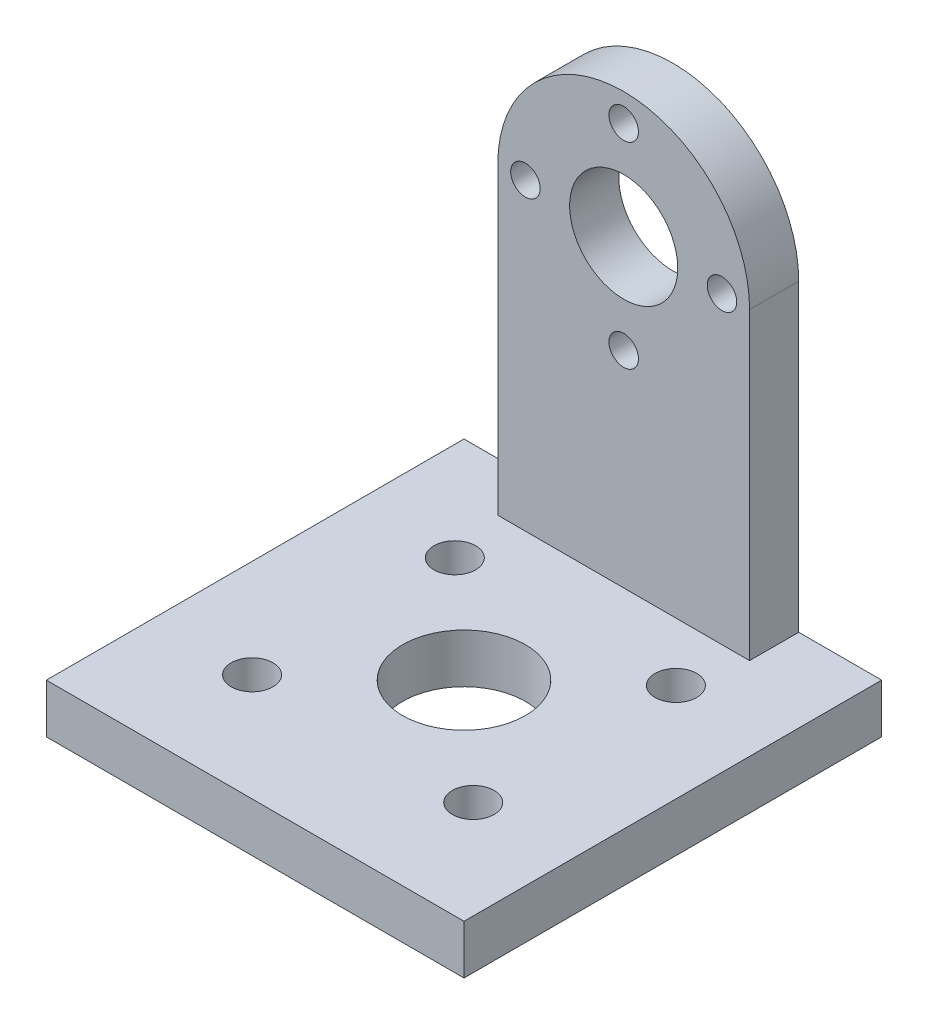
ISO-10303-21;
HEADER;
FILE_DESCRIPTION(('STEP AP214'),'2;1');
FILE_NAME('part.step','',(''),(''),'','','');
FILE_SCHEMA(('AUTOMOTIVE_DESIGN { 1 0 10303 214 1 1 1 1 }'));
ENDSEC;
DATA;
#1=APPLICATION_CONTEXT('core data for automotive mechanical design processes');
#2=APPLICATION_PROTOCOL_DEFINITION('international standard','automotive_design',2000,#1);
#3=PRODUCT_CONTEXT('',#1,'mechanical');
#4=PRODUCT('Part','Part','',(#3));
#5=PRODUCT_RELATED_PRODUCT_CATEGORY('part','',(#4));
#6=PRODUCT_DEFINITION_FORMATION('','',#4);
#7=PRODUCT_DEFINITION_CONTEXT('part definition',#1,'design');
#8=PRODUCT_DEFINITION('design','',#6,#7);
#9=PRODUCT_DEFINITION_SHAPE('','',#8);
#10=(LENGTH_UNIT() NAMED_UNIT(*) SI_UNIT(.MILLI.,.METRE.));
#11=(NAMED_UNIT(*) PLANE_ANGLE_UNIT() SI_UNIT($,.RADIAN.));
#12=(NAMED_UNIT(*) SI_UNIT($,.STERADIAN.) SOLID_ANGLE_UNIT());
#13=UNCERTAINTY_MEASURE_WITH_UNIT(LENGTH_MEASURE(1.E-05),#10,'distance_accuracy_value','');
#14=(GEOMETRIC_REPRESENTATION_CONTEXT(3) GLOBAL_UNCERTAINTY_ASSIGNED_CONTEXT((#13)) GLOBAL_UNIT_ASSIGNED_CONTEXT((#10,
#11,#12)) REPRESENTATION_CONTEXT('',''));
#15=CARTESIAN_POINT('',(0.,0.,0.));
#16=DIRECTION('',(0.,0.,1.));
#17=DIRECTION('',(1.,0.,0.));
#18=AXIS2_PLACEMENT_3D('',#15,#16,#17);
#19=CARTESIAN_POINT('',(10.25,0.,4.));
#20=DIRECTION('',(1.,0.,0.));
#21=DIRECTION('',(0.,1.,0.));
#22=AXIS2_PLACEMENT_3D('',#19,#20,#21);
#23=PLANE('',#22);
#24=DIRECTION('',(0.,-1.,0.));
#25=VECTOR('',#24,1.);
#26=CARTESIAN_POINT('',(10.25,0.,4.));
#27=LINE('',#26,#25);
#28=CARTESIAN_POINT('',(10.25,0.,4.));
#29=VERTEX_POINT('',#28);
#30=CARTESIAN_POINT('',(10.25,-24.75,4.));
#31=VERTEX_POINT('',#30);
#32=EDGE_CURVE('E181',#29,#31,#27,.T.);
#33=ORIENTED_EDGE('',*,*,#32,.T.);
#34=DIRECTION('',(0.,0.,-1.));
#35=VECTOR('',#34,1.);
#36=CARTESIAN_POINT('',(10.25,-24.75,4.));
#37=LINE('',#36,#35);
#38=CARTESIAN_POINT('',(10.25,-24.75,0.));
#39=VERTEX_POINT('',#38);
#40=EDGE_CURVE('E162',#31,#39,#37,.T.);
#41=ORIENTED_EDGE('',*,*,#40,.T.);
#42=DIRECTION('',(0.,-1.,0.));
#43=VECTOR('',#42,1.);
#44=CARTESIAN_POINT('',(10.25,0.,0.));
#45=LINE('',#44,#43);
#46=CARTESIAN_POINT('',(10.25,0.,0.));
#47=VERTEX_POINT('',#46);
#48=EDGE_CURVE('E202',#47,#39,#45,.T.);
#49=ORIENTED_EDGE('',*,*,#48,.F.);
#50=DIRECTION('',(0.,0.,-1.));
#51=VECTOR('',#50,1.);
#52=CARTESIAN_POINT('',(10.25,0.,4.));
#53=LINE('',#52,#51);
#54=EDGE_CURVE('E11',#29,#47,#53,.T.);
#55=ORIENTED_EDGE('',*,*,#54,.F.);
#56=EDGE_LOOP('',(#33,#41,#49,#55));
#57=FACE_BOUND('',#56,.T.);
#58=ADVANCED_FACE('F45',(#57),#23,.T.);
#59=CARTESIAN_POINT('',(-10.25,0.,4.));
#60=DIRECTION('',(1.,0.,0.));
#61=DIRECTION('',(0.,1.,0.));
#62=AXIS2_PLACEMENT_3D('',#59,#60,#61);
#63=PLANE('',#62);
#64=DIRECTION('',(0.,0.,-1.));
#65=VECTOR('',#64,1.);
#66=CARTESIAN_POINT('',(-10.25,-24.75,4.));
#67=LINE('',#66,#65);
#68=CARTESIAN_POINT('',(-10.25,-24.75,4.));
#69=VERTEX_POINT('',#68);
#70=CARTESIAN_POINT('',(-10.25,-24.75,0.));
#71=VERTEX_POINT('',#70);
#72=EDGE_CURVE('E60',#69,#71,#67,.T.);
#73=ORIENTED_EDGE('',*,*,#72,.F.);
#74=DIRECTION('',(0.,-1.,0.));
#75=VECTOR('',#74,1.);
#76=CARTESIAN_POINT('',(-10.25,0.,4.));
#77=LINE('',#76,#75);
#78=CARTESIAN_POINT('',(-10.25,0.,4.));
#79=VERTEX_POINT('',#78);
#80=EDGE_CURVE('E186',#79,#69,#77,.T.);
#81=ORIENTED_EDGE('',*,*,#80,.F.);
#82=DIRECTION('',(0.,0.,-1.));
#83=VECTOR('',#82,1.);
#84=CARTESIAN_POINT('',(-10.25,0.,4.));
#85=LINE('',#84,#83);
#86=CARTESIAN_POINT('',(-10.25,0.,0.));
#87=VERTEX_POINT('',#86);
#88=EDGE_CURVE('E53',#79,#87,#85,.T.);
#89=ORIENTED_EDGE('',*,*,#88,.T.);
#90=DIRECTION('',(0.,-1.,0.));
#91=VECTOR('',#90,1.);
#92=CARTESIAN_POINT('',(-10.25,0.,0.));
#93=LINE('',#92,#91);
#94=EDGE_CURVE('E208',#87,#71,#93,.T.);
#95=ORIENTED_EDGE('',*,*,#94,.T.);
#96=EDGE_LOOP('',(#73,#81,#89,#95));
#97=FACE_BOUND('',#96,.T.);
#98=ADVANCED_FACE('F212',(#97),#63,.F.);
#99=CARTESIAN_POINT('',(0.,0.,4.));
#100=DIRECTION('',(0.,0.,1.));
#101=DIRECTION('',(1.,0.,0.));
#102=AXIS2_PLACEMENT_3D('',#99,#100,#101);
#103=PLANE('',#102);
#104=CARTESIAN_POINT('',(0.,-8.,4.));
#105=DIRECTION('',(0.,0.,1.));
#106=DIRECTION('',(1.,0.,0.));
#107=AXIS2_PLACEMENT_3D('',#104,#105,#106);
#108=CIRCLE('',#107,1.2);
#109=CARTESIAN_POINT('',(1.19999999999994,-8.,4.));
#110=VERTEX_POINT('',#109);
#111=EDGE_CURVE('E165',#110,#110,#108,.T.);
#112=ORIENTED_EDGE('',*,*,#111,.F.);
#113=EDGE_LOOP('',(#112));
#114=FACE_BOUND('',#113,.T.);
#115=CARTESIAN_POINT('',(8.,0.,4.));
#116=DIRECTION('',(0.,0.,1.));
#117=DIRECTION('',(1.,0.,0.));
#118=AXIS2_PLACEMENT_3D('',#115,#116,#117);
#119=CIRCLE('',#118,1.2);
#120=CARTESIAN_POINT('',(9.2,0.,4.));
#121=VERTEX_POINT('',#120);
#122=EDGE_CURVE('E168',#121,#121,#119,.T.);
#123=ORIENTED_EDGE('',*,*,#122,.F.);
#124=EDGE_LOOP('',(#123));
#125=FACE_BOUND('',#124,.T.);
#126=CARTESIAN_POINT('',(0.,8.,4.));
#127=DIRECTION('',(0.,0.,1.));
#128=DIRECTION('',(1.,0.,0.));
#129=AXIS2_PLACEMENT_3D('',#126,#127,#128);
#130=CIRCLE('',#129,1.2);
#131=CARTESIAN_POINT('',(1.2,8.,4.));
#132=VERTEX_POINT('',#131);
#133=EDGE_CURVE('E172',#132,#132,#130,.T.);
#134=ORIENTED_EDGE('',*,*,#133,.F.);
#135=EDGE_LOOP('',(#134));
#136=FACE_BOUND('',#135,.T.);
#137=CARTESIAN_POINT('',(0.,0.,4.));
#138=DIRECTION('',(0.,0.,1.));
#139=DIRECTION('',(1.,0.,0.));
#140=AXIS2_PLACEMENT_3D('',#137,#138,#139);
#141=CIRCLE('',#140,4.4);
#142=CARTESIAN_POINT('',(4.4,0.,4.));
#143=VERTEX_POINT('',#142);
#144=EDGE_CURVE('E175',#143,#143,#141,.T.);
#145=ORIENTED_EDGE('',*,*,#144,.F.);
#146=EDGE_LOOP('',(#145));
#147=FACE_BOUND('',#146,.T.);
#148=CARTESIAN_POINT('',(-8.,0.,4.));
#149=DIRECTION('',(0.,0.,1.));
#150=DIRECTION('',(1.,0.,0.));
#151=AXIS2_PLACEMENT_3D('',#148,#149,#150);
#152=CIRCLE('',#151,1.2);
#153=CARTESIAN_POINT('',(-6.8,0.,4.));
#154=VERTEX_POINT('',#153);
#155=EDGE_CURVE('E178',#154,#154,#152,.T.);
#156=ORIENTED_EDGE('',*,*,#155,.F.);
#157=EDGE_LOOP('',(#156));
#158=FACE_BOUND('',#157,.T.);
#159=ORIENTED_EDGE('',*,*,#80,.T.);
#160=DIRECTION('',(1.,0.,0.));
#161=VECTOR('',#160,1.);
#162=CARTESIAN_POINT('',(0.,-24.75,4.));
#163=LINE('',#162,#161);
#164=EDGE_CURVE('E67',#69,#31,#163,.T.);
#165=ORIENTED_EDGE('',*,*,#164,.T.);
#166=ORIENTED_EDGE('',*,*,#32,.F.);
#167=CARTESIAN_POINT('',(0.,0.,4.));
#168=DIRECTION('',(0.,0.,1.));
#169=DIRECTION('',(1.,0.,0.));
#170=AXIS2_PLACEMENT_3D('',#167,#168,#169);
#171=CIRCLE('',#170,10.25);
#172=EDGE_CURVE('E183',#29,#79,#171,.T.);
#173=ORIENTED_EDGE('',*,*,#172,.T.);
#174=EDGE_LOOP('',(#159,#165,#166,#173));
#175=FACE_BOUND('',#174,.T.);
#176=ADVANCED_FACE('F243',(#114,#125,#136,#147,#158,#175),#103,.T.);
#177=CARTESIAN_POINT('',(0.,0.,4.));
#178=DIRECTION('',(0.,0.,-1.));
#179=DIRECTION('',(-1.,0.,0.));
#180=AXIS2_PLACEMENT_3D('',#177,#178,#179);
#181=CYLINDRICAL_SURFACE('',#180,10.25);
#182=CARTESIAN_POINT('',(0.,0.,0.));
#183=DIRECTION('',(0.,0.,1.));
#184=DIRECTION('',(1.,0.,0.));
#185=AXIS2_PLACEMENT_3D('',#182,#183,#184);
#186=CIRCLE('',#185,10.25);
#187=EDGE_CURVE('E205',#47,#87,#186,.T.);
#188=ORIENTED_EDGE('',*,*,#187,.T.);
#189=ORIENTED_EDGE('',*,*,#88,.F.);
#190=ORIENTED_EDGE('',*,*,#172,.F.);
#191=ORIENTED_EDGE('',*,*,#54,.T.);
#192=EDGE_LOOP('',(#188,#189,#190,#191));
#193=FACE_BOUND('',#192,.T.);
#194=ADVANCED_FACE('F216',(#193),#181,.T.);
#195=CARTESIAN_POINT('',(-8.,0.,4.));
#196=DIRECTION('',(0.,0.,-1.));
#197=DIRECTION('',(-1.,0.,0.));
#198=AXIS2_PLACEMENT_3D('',#195,#196,#197);
#199=CYLINDRICAL_SURFACE('',#198,1.2);
#200=ORIENTED_EDGE('',*,*,#155,.T.);
#201=EDGE_LOOP('',(#200));
#202=FACE_BOUND('',#201,.T.);
#203=CARTESIAN_POINT('',(-8.,0.,0.));
#204=DIRECTION('',(0.,0.,1.));
#205=DIRECTION('',(1.,0.,0.));
#206=AXIS2_PLACEMENT_3D('',#203,#204,#205);
#207=CIRCLE('',#206,1.2);
#208=CARTESIAN_POINT('',(-6.8,0.,0.));
#209=VERTEX_POINT('',#208);
#210=EDGE_CURVE('E199',#209,#209,#207,.T.);
#211=ORIENTED_EDGE('',*,*,#210,.F.);
#212=EDGE_LOOP('',(#211));
#213=FACE_BOUND('',#212,.T.);
#214=ADVANCED_FACE('F247',(#202,#213),#199,.F.);
#215=CARTESIAN_POINT('',(0.,0.,4.));
#216=DIRECTION('',(0.,0.,-1.));
#217=DIRECTION('',(-1.,0.,0.));
#218=AXIS2_PLACEMENT_3D('',#215,#216,#217);
#219=CYLINDRICAL_SURFACE('',#218,4.4);
#220=ORIENTED_EDGE('',*,*,#144,.T.);
#221=EDGE_LOOP('',(#220));
#222=FACE_BOUND('',#221,.T.);
#223=CARTESIAN_POINT('',(0.,0.,0.));
#224=DIRECTION('',(0.,0.,1.));
#225=DIRECTION('',(1.,0.,0.));
#226=AXIS2_PLACEMENT_3D('',#223,#224,#225);
#227=CIRCLE('',#226,4.4);
#228=CARTESIAN_POINT('',(4.4,0.,0.));
#229=VERTEX_POINT('',#228);
#230=EDGE_CURVE('E196',#229,#229,#227,.T.);
#231=ORIENTED_EDGE('',*,*,#230,.F.);
#232=EDGE_LOOP('',(#231));
#233=FACE_BOUND('',#232,.T.);
#234=ADVANCED_FACE('F250',(#222,#233),#219,.F.);
#235=CARTESIAN_POINT('',(0.,8.,4.));
#236=DIRECTION('',(0.,0.,-1.));
#237=DIRECTION('',(-1.,0.,0.));
#238=AXIS2_PLACEMENT_3D('',#235,#236,#237);
#239=CYLINDRICAL_SURFACE('',#238,1.2);
#240=ORIENTED_EDGE('',*,*,#133,.T.);
#241=EDGE_LOOP('',(#240));
#242=FACE_BOUND('',#241,.T.);
#243=CARTESIAN_POINT('',(0.,8.,0.));
#244=DIRECTION('',(0.,0.,1.));
#245=DIRECTION('',(1.,0.,0.));
#246=AXIS2_PLACEMENT_3D('',#243,#244,#245);
#247=CIRCLE('',#246,1.2);
#248=CARTESIAN_POINT('',(1.2,8.,0.));
#249=VERTEX_POINT('',#248);
#250=EDGE_CURVE('E193',#249,#249,#247,.T.);
#251=ORIENTED_EDGE('',*,*,#250,.F.);
#252=EDGE_LOOP('',(#251));
#253=FACE_BOUND('',#252,.T.);
#254=ADVANCED_FACE('F254',(#242,#253),#239,.F.);
#255=CARTESIAN_POINT('',(8.,0.,4.));
#256=DIRECTION('',(0.,0.,-1.));
#257=DIRECTION('',(-1.,0.,0.));
#258=AXIS2_PLACEMENT_3D('',#255,#256,#257);
#259=CYLINDRICAL_SURFACE('',#258,1.2);
#260=ORIENTED_EDGE('',*,*,#122,.T.);
#261=EDGE_LOOP('',(#260));
#262=FACE_BOUND('',#261,.T.);
#263=CARTESIAN_POINT('',(8.,0.,0.));
#264=DIRECTION('',(0.,0.,1.));
#265=DIRECTION('',(1.,0.,0.));
#266=AXIS2_PLACEMENT_3D('',#263,#264,#265);
#267=CIRCLE('',#266,1.2);
#268=CARTESIAN_POINT('',(9.2,0.,0.));
#269=VERTEX_POINT('',#268);
#270=EDGE_CURVE('E190',#269,#269,#267,.T.);
#271=ORIENTED_EDGE('',*,*,#270,.F.);
#272=EDGE_LOOP('',(#271));
#273=FACE_BOUND('',#272,.T.);
#274=ADVANCED_FACE('F257',(#262,#273),#259,.F.);
#275=CARTESIAN_POINT('',(0.,-8.,4.));
#276=DIRECTION('',(0.,0.,-1.));
#277=DIRECTION('',(-1.,0.,0.));
#278=AXIS2_PLACEMENT_3D('',#275,#276,#277);
#279=CYLINDRICAL_SURFACE('',#278,1.2);
#280=ORIENTED_EDGE('',*,*,#111,.T.);
#281=EDGE_LOOP('',(#280));
#282=FACE_BOUND('',#281,.T.);
#283=CARTESIAN_POINT('',(0.,-8.,0.));
#284=DIRECTION('',(0.,0.,1.));
#285=DIRECTION('',(1.,0.,0.));
#286=AXIS2_PLACEMENT_3D('',#283,#284,#285);
#287=CIRCLE('',#286,1.2);
#288=CARTESIAN_POINT('',(1.19999999999994,-8.,0.));
#289=VERTEX_POINT('',#288);
#290=EDGE_CURVE('E164',#289,#289,#287,.T.);
#291=ORIENTED_EDGE('',*,*,#290,.F.);
#292=EDGE_LOOP('',(#291));
#293=FACE_BOUND('',#292,.T.);
#294=ADVANCED_FACE('F47',(#282,#293),#279,.F.);
#295=CARTESIAN_POINT('',(0.,-28.75,4.));
#296=DIRECTION('',(0.,1.,0.));
#297=DIRECTION('',(-1.,0.,0.));
#298=AXIS2_PLACEMENT_3D('',#295,#296,#297);
#299=PLANE('',#298);
#300=DIRECTION('',(1.,0.,0.));
#301=VECTOR('',#300,1.);
#302=CARTESIAN_POINT('',(0.,-28.75,0.));
#303=LINE('',#302,#301);
#304=CARTESIAN_POINT('',(-17.,-28.75,0.));
#305=VERTEX_POINT('',#304);
#306=CARTESIAN_POINT('',(17.,-28.75,0.));
#307=VERTEX_POINT('',#306);
#308=EDGE_CURVE('E169',#305,#307,#303,.T.);
#309=ORIENTED_EDGE('',*,*,#308,.T.);
#310=DIRECTION('',(0.,0.,1.));
#311=VECTOR('',#310,1.);
#312=CARTESIAN_POINT('',(17.,-28.75,0.));
#313=LINE('',#312,#311);
#314=CARTESIAN_POINT('',(17.,-28.75,34.));
#315=VERTEX_POINT('',#314);
#316=EDGE_CURVE('E151',#307,#315,#313,.T.);
#317=ORIENTED_EDGE('',*,*,#316,.T.);
#318=DIRECTION('',(-1.,0.,0.));
#319=VECTOR('',#318,1.);
#320=CARTESIAN_POINT('',(17.,-28.75,34.));
#321=LINE('',#320,#319);
#322=CARTESIAN_POINT('',(-17.,-28.75,34.));
#323=VERTEX_POINT('',#322);
#324=EDGE_CURVE('E115',#315,#323,#321,.T.);
#325=ORIENTED_EDGE('',*,*,#324,.T.);
#326=DIRECTION('',(0.,0.,-1.));
#327=VECTOR('',#326,1.);
#328=CARTESIAN_POINT('',(-17.,-28.75,0.));
#329=LINE('',#328,#327);
#330=EDGE_CURVE('E139',#323,#305,#329,.T.);
#331=ORIENTED_EDGE('',*,*,#330,.T.);
#332=EDGE_LOOP('',(#309,#317,#325,#331));
#333=FACE_BOUND('',#332,.T.);
#334=CARTESIAN_POINT('',(8.99999999999983,-28.75,25.25));
#335=DIRECTION('',(0.,-1.,0.));
#336=DIRECTION('',(1.,0.,0.));
#337=AXIS2_PLACEMENT_3D('',#334,#335,#336);
#338=CIRCLE('',#337,1.7);
#339=CARTESIAN_POINT('',(10.6999999999998,-28.75,25.25));
#340=VERTEX_POINT('',#339);
#341=EDGE_CURVE('E442',#340,#340,#338,.T.);
#342=ORIENTED_EDGE('',*,*,#341,.F.);
#343=EDGE_LOOP('',(#342));
#344=FACE_BOUND('',#343,.T.);
#345=CARTESIAN_POINT('',(-9.00000000000017,-28.75,25.25));
#346=DIRECTION('',(0.,-1.,0.));
#347=DIRECTION('',(1.,0.,0.));
#348=AXIS2_PLACEMENT_3D('',#345,#346,#347);
#349=CIRCLE('',#348,1.7);
#350=CARTESIAN_POINT('',(-7.30000000000017,-28.75,25.25));
#351=VERTEX_POINT('',#350);
#352=EDGE_CURVE('E444',#351,#351,#349,.T.);
#353=ORIENTED_EDGE('',*,*,#352,.F.);
#354=EDGE_LOOP('',(#353));
#355=FACE_BOUND('',#354,.T.);
#356=CARTESIAN_POINT('',(-8.99999999999999,-28.75,8.75));
#357=DIRECTION('',(0.,-1.,0.));
#358=DIRECTION('',(1.,0.,0.));
#359=AXIS2_PLACEMENT_3D('',#356,#357,#358);
#360=CIRCLE('',#359,1.7);
#361=CARTESIAN_POINT('',(-7.29999999999999,-28.75,8.75));
#362=VERTEX_POINT('',#361);
#363=EDGE_CURVE('E450',#362,#362,#360,.T.);
#364=ORIENTED_EDGE('',*,*,#363,.F.);
#365=EDGE_LOOP('',(#364));
#366=FACE_BOUND('',#365,.T.);
#367=CARTESIAN_POINT('',(9.00000000000001,-28.75,8.75));
#368=DIRECTION('',(0.,-1.,0.));
#369=DIRECTION('',(1.,0.,0.));
#370=AXIS2_PLACEMENT_3D('',#367,#368,#369);
#371=CIRCLE('',#370,1.7);
#372=CARTESIAN_POINT('',(10.7,-28.75,8.75));
#373=VERTEX_POINT('',#372);
#374=EDGE_CURVE('E456',#373,#373,#371,.T.);
#375=ORIENTED_EDGE('',*,*,#374,.F.);
#376=EDGE_LOOP('',(#375));
#377=FACE_BOUND('',#376,.T.);
#378=CARTESIAN_POINT('',(0.,-28.75,17.));
#379=DIRECTION('',(0.,-1.,0.));
#380=DIRECTION('',(1.,0.,0.));
#381=AXIS2_PLACEMENT_3D('',#378,#379,#380);
#382=CIRCLE('',#381,5.);
#383=CARTESIAN_POINT('',(5.00000000000001,-28.75,17.));
#384=VERTEX_POINT('',#383);
#385=EDGE_CURVE('E144',#384,#384,#382,.T.);
#386=ORIENTED_EDGE('',*,*,#385,.F.);
#387=EDGE_LOOP('',(#386));
#388=FACE_BOUND('',#387,.T.);
#389=ADVANCED_FACE('F223',(#333,#344,#355,#366,#377,#388),#299,.F.);
#390=CARTESIAN_POINT('',(0.,0.,0.));
#391=DIRECTION('',(0.,0.,1.));
#392=DIRECTION('',(1.,0.,0.));
#393=AXIS2_PLACEMENT_3D('',#390,#391,#392);
#394=PLANE('',#393);
#395=ORIENTED_EDGE('',*,*,#308,.F.);
#396=DIRECTION('',(0.,-1.,0.));
#397=VECTOR('',#396,1.);
#398=CARTESIAN_POINT('',(-17.,-24.75,0.));
#399=LINE('',#398,#397);
#400=CARTESIAN_POINT('',(-17.,-24.75,0.));
#401=VERTEX_POINT('',#400);
#402=EDGE_CURVE('E156',#401,#305,#399,.T.);
#403=ORIENTED_EDGE('',*,*,#402,.F.);
#404=DIRECTION('',(1.,0.,0.));
#405=VECTOR('',#404,1.);
#406=CARTESIAN_POINT('',(17.,-24.75,0.));
#407=LINE('',#406,#405);
#408=EDGE_CURVE('E121',#401,#71,#407,.T.);
#409=ORIENTED_EDGE('',*,*,#408,.T.);
#410=ORIENTED_EDGE('',*,*,#94,.F.);
#411=ORIENTED_EDGE('',*,*,#187,.F.);
#412=ORIENTED_EDGE('',*,*,#48,.T.);
#413=CARTESIAN_POINT('',(17.,-24.75,0.));
#414=VERTEX_POINT('',#413);
#415=EDGE_CURVE('E148',#39,#414,#407,.T.);
#416=ORIENTED_EDGE('',*,*,#415,.T.);
#417=DIRECTION('',(0.,-1.,0.));
#418=VECTOR('',#417,1.);
#419=CARTESIAN_POINT('',(17.,-24.75,0.));
#420=LINE('',#419,#418);
#421=EDGE_CURVE('E138',#414,#307,#420,.T.);
#422=ORIENTED_EDGE('',*,*,#421,.T.);
#423=EDGE_LOOP('',(#395,#403,#409,#410,#411,#412,#416,#422));
#424=FACE_BOUND('',#423,.T.);
#425=ORIENTED_EDGE('',*,*,#210,.T.);
#426=EDGE_LOOP('',(#425));
#427=FACE_BOUND('',#426,.T.);
#428=ORIENTED_EDGE('',*,*,#230,.T.);
#429=EDGE_LOOP('',(#428));
#430=FACE_BOUND('',#429,.T.);
#431=ORIENTED_EDGE('',*,*,#250,.T.);
#432=EDGE_LOOP('',(#431));
#433=FACE_BOUND('',#432,.T.);
#434=ORIENTED_EDGE('',*,*,#270,.T.);
#435=EDGE_LOOP('',(#434));
#436=FACE_BOUND('',#435,.T.);
#437=ORIENTED_EDGE('',*,*,#290,.T.);
#438=EDGE_LOOP('',(#437));
#439=FACE_BOUND('',#438,.T.);
#440=ADVANCED_FACE('F219',(#424,#427,#430,#433,#436,#439),#394,.F.);
#441=CARTESIAN_POINT('',(17.,-24.75,0.));
#442=DIRECTION('',(1.,0.,0.));
#443=DIRECTION('',(0.,1.,0.));
#444=AXIS2_PLACEMENT_3D('',#441,#442,#443);
#445=PLANE('',#444);
#446=ORIENTED_EDGE('',*,*,#316,.F.);
#447=ORIENTED_EDGE('',*,*,#421,.F.);
#448=DIRECTION('',(0.,0.,1.));
#449=VECTOR('',#448,1.);
#450=CARTESIAN_POINT('',(17.,-24.75,0.));
#451=LINE('',#450,#449);
#452=CARTESIAN_POINT('',(17.,-24.75,34.));
#453=VERTEX_POINT('',#452);
#454=EDGE_CURVE('E130',#414,#453,#451,.T.);
#455=ORIENTED_EDGE('',*,*,#454,.T.);
#456=DIRECTION('',(0.,-1.,0.));
#457=VECTOR('',#456,1.);
#458=CARTESIAN_POINT('',(17.,-24.75,34.));
#459=LINE('',#458,#457);
#460=EDGE_CURVE('E110',#453,#315,#459,.T.);
#461=ORIENTED_EDGE('',*,*,#460,.T.);
#462=EDGE_LOOP('',(#446,#447,#455,#461));
#463=FACE_BOUND('',#462,.T.);
#464=ADVANCED_FACE('F136',(#463),#445,.T.);
#465=CARTESIAN_POINT('',(-17.,-24.75,0.));
#466=DIRECTION('',(-1.,0.,0.));
#467=DIRECTION('',(0.,0.,1.));
#468=AXIS2_PLACEMENT_3D('',#465,#466,#467);
#469=PLANE('',#468);
#470=ORIENTED_EDGE('',*,*,#330,.F.);
#471=DIRECTION('',(0.,-1.,0.));
#472=VECTOR('',#471,1.);
#473=CARTESIAN_POINT('',(-17.,-24.75,34.));
#474=LINE('',#473,#472);
#475=CARTESIAN_POINT('',(-17.,-24.75,34.));
#476=VERTEX_POINT('',#475);
#477=EDGE_CURVE('E120',#476,#323,#474,.T.);
#478=ORIENTED_EDGE('',*,*,#477,.F.);
#479=DIRECTION('',(0.,0.,-1.));
#480=VECTOR('',#479,1.);
#481=CARTESIAN_POINT('',(-17.,-24.75,0.));
#482=LINE('',#481,#480);
#483=EDGE_CURVE('E133',#476,#401,#482,.T.);
#484=ORIENTED_EDGE('',*,*,#483,.T.);
#485=ORIENTED_EDGE('',*,*,#402,.T.);
#486=EDGE_LOOP('',(#470,#478,#484,#485));
#487=FACE_BOUND('',#486,.T.);
#488=ADVANCED_FACE('F227',(#487),#469,.T.);
#489=CARTESIAN_POINT('',(17.,-24.75,34.));
#490=DIRECTION('',(0.,0.,1.));
#491=DIRECTION('',(1.,0.,0.));
#492=AXIS2_PLACEMENT_3D('',#489,#490,#491);
#493=PLANE('',#492);
#494=ORIENTED_EDGE('',*,*,#324,.F.);
#495=ORIENTED_EDGE('',*,*,#460,.F.);
#496=DIRECTION('',(-1.,0.,0.));
#497=VECTOR('',#496,1.);
#498=CARTESIAN_POINT('',(17.,-24.75,34.));
#499=LINE('',#498,#497);
#500=EDGE_CURVE('E113',#453,#476,#499,.T.);
#501=ORIENTED_EDGE('',*,*,#500,.T.);
#502=ORIENTED_EDGE('',*,*,#477,.T.);
#503=EDGE_LOOP('',(#494,#495,#501,#502));
#504=FACE_BOUND('',#503,.T.);
#505=ADVANCED_FACE('F112',(#504),#493,.T.);
#506=CARTESIAN_POINT('',(0.,-24.75,0.));
#507=DIRECTION('',(0.,-1.,0.));
#508=DIRECTION('',(1.,0.,0.));
#509=AXIS2_PLACEMENT_3D('',#506,#507,#508);
#510=PLANE('',#509);
#511=ORIENTED_EDGE('',*,*,#40,.F.);
#512=ORIENTED_EDGE('',*,*,#164,.F.);
#513=ORIENTED_EDGE('',*,*,#72,.T.);
#514=ORIENTED_EDGE('',*,*,#408,.F.);
#515=ORIENTED_EDGE('',*,*,#483,.F.);
#516=ORIENTED_EDGE('',*,*,#500,.F.);
#517=ORIENTED_EDGE('',*,*,#454,.F.);
#518=ORIENTED_EDGE('',*,*,#415,.F.);
#519=EDGE_LOOP('',(#511,#512,#513,#514,#515,#516,#517,#518));
#520=FACE_BOUND('',#519,.T.);
#521=CARTESIAN_POINT('',(8.99999999999983,-24.75,25.25));
#522=DIRECTION('',(0.,-1.,0.));
#523=DIRECTION('',(1.,0.,0.));
#524=AXIS2_PLACEMENT_3D('',#521,#522,#523);
#525=CIRCLE('',#524,1.7);
#526=CARTESIAN_POINT('',(10.6999999999998,-24.75,25.25));
#527=VERTEX_POINT('',#526);
#528=EDGE_CURVE('E439',#527,#527,#525,.T.);
#529=ORIENTED_EDGE('',*,*,#528,.T.);
#530=EDGE_LOOP('',(#529));
#531=FACE_BOUND('',#530,.T.);
#532=CARTESIAN_POINT('',(-9.00000000000017,-24.75,25.25));
#533=DIRECTION('',(0.,-1.,0.));
#534=DIRECTION('',(1.,0.,0.));
#535=AXIS2_PLACEMENT_3D('',#532,#533,#534);
#536=CIRCLE('',#535,1.7);
#537=CARTESIAN_POINT('',(-7.30000000000017,-24.75,25.25));
#538=VERTEX_POINT('',#537);
#539=EDGE_CURVE('E447',#538,#538,#536,.T.);
#540=ORIENTED_EDGE('',*,*,#539,.T.);
#541=EDGE_LOOP('',(#540));
#542=FACE_BOUND('',#541,.T.);
#543=CARTESIAN_POINT('',(-8.99999999999999,-24.75,8.75));
#544=DIRECTION('',(0.,-1.,0.));
#545=DIRECTION('',(1.,0.,0.));
#546=AXIS2_PLACEMENT_3D('',#543,#544,#545);
#547=CIRCLE('',#546,1.7);
#548=CARTESIAN_POINT('',(-7.29999999999999,-24.75,8.75));
#549=VERTEX_POINT('',#548);
#550=EDGE_CURVE('E453',#549,#549,#547,.T.);
#551=ORIENTED_EDGE('',*,*,#550,.T.);
#552=EDGE_LOOP('',(#551));
#553=FACE_BOUND('',#552,.T.);
#554=CARTESIAN_POINT('',(9.00000000000001,-24.75,8.75));
#555=DIRECTION('',(0.,-1.,0.));
#556=DIRECTION('',(1.,0.,0.));
#557=AXIS2_PLACEMENT_3D('',#554,#555,#556);
#558=CIRCLE('',#557,1.7);
#559=CARTESIAN_POINT('',(10.7,-24.75,8.75));
#560=VERTEX_POINT('',#559);
#561=EDGE_CURVE('E459',#560,#560,#558,.T.);
#562=ORIENTED_EDGE('',*,*,#561,.T.);
#563=EDGE_LOOP('',(#562));
#564=FACE_BOUND('',#563,.T.);
#565=CARTESIAN_POINT('',(0.,-24.75,17.));
#566=DIRECTION('',(0.,-1.,0.));
#567=DIRECTION('',(1.,0.,0.));
#568=AXIS2_PLACEMENT_3D('',#565,#566,#567);
#569=CIRCLE('',#568,5.);
#570=CARTESIAN_POINT('',(5.00000000000001,-24.75,17.));
#571=VERTEX_POINT('',#570);
#572=EDGE_CURVE('E153',#571,#571,#569,.T.);
#573=ORIENTED_EDGE('',*,*,#572,.T.);
#574=EDGE_LOOP('',(#573));
#575=FACE_BOUND('',#574,.T.);
#576=ADVANCED_FACE('F127',(#520,#531,#542,#553,#564,#575),#510,.F.);
#577=CARTESIAN_POINT('',(0.,-24.75,17.));
#578=DIRECTION('',(0.,-1.,0.));
#579=DIRECTION('',(1.,0.,0.));
#580=AXIS2_PLACEMENT_3D('',#577,#578,#579);
#581=CYLINDRICAL_SURFACE('',#580,5.);
#582=ORIENTED_EDGE('',*,*,#572,.F.);
#583=EDGE_LOOP('',(#582));
#584=FACE_BOUND('',#583,.T.);
#585=ORIENTED_EDGE('',*,*,#385,.T.);
#586=EDGE_LOOP('',(#585));
#587=FACE_BOUND('',#586,.T.);
#588=ADVANCED_FACE('F383',(#584,#587),#581,.F.);
#589=CARTESIAN_POINT('',(9.00000000000001,-24.75,8.75));
#590=DIRECTION('',(0.,-1.,0.));
#591=DIRECTION('',(1.,0.,0.));
#592=AXIS2_PLACEMENT_3D('',#589,#590,#591);
#593=CYLINDRICAL_SURFACE('',#592,1.7);
#594=ORIENTED_EDGE('',*,*,#561,.F.);
#595=EDGE_LOOP('',(#594));
#596=FACE_BOUND('',#595,.T.);
#597=ORIENTED_EDGE('',*,*,#374,.T.);
#598=EDGE_LOOP('',(#597));
#599=FACE_BOUND('',#598,.T.);
#600=ADVANCED_FACE('F390',(#596,#599),#593,.F.);
#601=CARTESIAN_POINT('',(-8.99999999999999,-24.75,8.75));
#602=DIRECTION('',(0.,-1.,0.));
#603=DIRECTION('',(1.,0.,0.));
#604=AXIS2_PLACEMENT_3D('',#601,#602,#603);
#605=CYLINDRICAL_SURFACE('',#604,1.7);
#606=ORIENTED_EDGE('',*,*,#550,.F.);
#607=EDGE_LOOP('',(#606));
#608=FACE_BOUND('',#607,.T.);
#609=ORIENTED_EDGE('',*,*,#363,.T.);
#610=EDGE_LOOP('',(#609));
#611=FACE_BOUND('',#610,.T.);
#612=ADVANCED_FACE('F399',(#608,#611),#605,.F.);
#613=CARTESIAN_POINT('',(-9.00000000000017,-24.75,25.25));
#614=DIRECTION('',(0.,-1.,0.));
#615=DIRECTION('',(1.,0.,0.));
#616=AXIS2_PLACEMENT_3D('',#613,#614,#615);
#617=CYLINDRICAL_SURFACE('',#616,1.7);
#618=ORIENTED_EDGE('',*,*,#539,.F.);
#619=EDGE_LOOP('',(#618));
#620=FACE_BOUND('',#619,.T.);
#621=ORIENTED_EDGE('',*,*,#352,.T.);
#622=EDGE_LOOP('',(#621));
#623=FACE_BOUND('',#622,.T.);
#624=ADVANCED_FACE('F408',(#620,#623),#617,.F.);
#625=CARTESIAN_POINT('',(8.99999999999983,-24.75,25.25));
#626=DIRECTION('',(0.,-1.,0.));
#627=DIRECTION('',(1.,0.,0.));
#628=AXIS2_PLACEMENT_3D('',#625,#626,#627);
#629=CYLINDRICAL_SURFACE('',#628,1.7);
#630=ORIENTED_EDGE('',*,*,#528,.F.);
#631=EDGE_LOOP('',(#630));
#632=FACE_BOUND('',#631,.T.);
#633=ORIENTED_EDGE('',*,*,#341,.T.);
#634=EDGE_LOOP('',(#633));
#635=FACE_BOUND('',#634,.T.);
#636=ADVANCED_FACE('F417',(#632,#635),#629,.F.);
#637=CLOSED_SHELL('',(#58,#98,#176,#194,#214,#234,#254,#274,#294,#389,#440,#464,#488,#505,#576,
#588,#600,#612,#624,#636));
#638=MANIFOLD_SOLID_BREP('B2',#637);
#639=ADVANCED_BREP_SHAPE_REPRESENTATION('',(#18,#638),#14);
#640=SHAPE_DEFINITION_REPRESENTATION(#9,#639);
ENDSEC;
END-ISO-10303-21;
